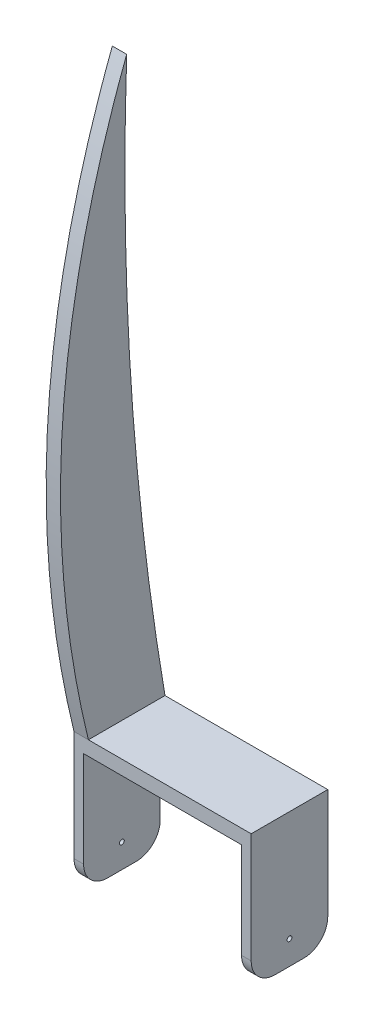
ISO-10303-21;
HEADER;
FILE_DESCRIPTION(('STEP AP214'),'2;1');
FILE_NAME('part.step','',(''),(''),'','','');
FILE_SCHEMA(('AUTOMOTIVE_DESIGN { 1 0 10303 214 1 1 1 1 }'));
ENDSEC;
DATA;
#1=APPLICATION_CONTEXT('core data for automotive mechanical design processes');
#2=APPLICATION_PROTOCOL_DEFINITION('international standard','automotive_design',2000,#1);
#3=PRODUCT_CONTEXT('',#1,'mechanical');
#4=PRODUCT('Part','Part','',(#3));
#5=PRODUCT_RELATED_PRODUCT_CATEGORY('part','',(#4));
#6=PRODUCT_DEFINITION_FORMATION('','',#4);
#7=PRODUCT_DEFINITION_CONTEXT('part definition',#1,'design');
#8=PRODUCT_DEFINITION('design','',#6,#7);
#9=PRODUCT_DEFINITION_SHAPE('','',#8);
#10=(LENGTH_UNIT() NAMED_UNIT(*) SI_UNIT(.MILLI.,.METRE.));
#11=(NAMED_UNIT(*) PLANE_ANGLE_UNIT() SI_UNIT($,.RADIAN.));
#12=(NAMED_UNIT(*) SI_UNIT($,.STERADIAN.) SOLID_ANGLE_UNIT());
#13=UNCERTAINTY_MEASURE_WITH_UNIT(LENGTH_MEASURE(1.E-05),#10,'distance_accuracy_value','');
#14=(GEOMETRIC_REPRESENTATION_CONTEXT(3) GLOBAL_UNCERTAINTY_ASSIGNED_CONTEXT((#13)) GLOBAL_UNIT_ASSIGNED_CONTEXT((#10,
#11,#12)) REPRESENTATION_CONTEXT('',''));
#15=CARTESIAN_POINT('',(0.,0.,0.));
#16=DIRECTION('',(0.,0.,1.));
#17=DIRECTION('',(1.,0.,0.));
#18=AXIS2_PLACEMENT_3D('',#15,#16,#17);
#19=CARTESIAN_POINT('',(0.,3.,0.));
#20=DIRECTION('',(0.,1.,0.));
#21=DIRECTION('',(0.,0.,1.));
#22=AXIS2_PLACEMENT_3D('',#19,#20,#21);
#23=PLANE('',#22);
#24=DIRECTION('',(-1.,0.,0.));
#25=VECTOR('',#24,1.);
#26=CARTESIAN_POINT('',(18.5,3.,-8.));
#27=LINE('',#26,#25);
#28=CARTESIAN_POINT('',(18.5,3.,-8.));
#29=VERTEX_POINT('',#28);
#30=CARTESIAN_POINT('',(-15.5,3.,-7.99999999999999));
#31=VERTEX_POINT('',#30);
#32=EDGE_CURVE('E284',#29,#31,#27,.T.);
#33=ORIENTED_EDGE('',*,*,#32,.T.);
#34=DIRECTION('',(0.,0.,1.));
#35=VECTOR('',#34,1.);
#36=CARTESIAN_POINT('',(-15.5,3.,8.00000000000001));
#37=LINE('',#36,#35);
#38=CARTESIAN_POINT('',(-15.5,3.,8.00000000000001));
#39=VERTEX_POINT('',#38);
#40=EDGE_CURVE('E153',#31,#39,#37,.T.);
#41=ORIENTED_EDGE('',*,*,#40,.T.);
#42=DIRECTION('',(1.,0.,0.));
#43=VECTOR('',#42,1.);
#44=CARTESIAN_POINT('',(18.5,3.,8.));
#45=LINE('',#44,#43);
#46=CARTESIAN_POINT('',(18.5,3.,8.));
#47=VERTEX_POINT('',#46);
#48=EDGE_CURVE('E281',#39,#47,#45,.T.);
#49=ORIENTED_EDGE('',*,*,#48,.T.);
#50=DIRECTION('',(0.,0.,-1.));
#51=VECTOR('',#50,1.);
#52=CARTESIAN_POINT('',(18.5,3.,8.));
#53=LINE('',#52,#51);
#54=EDGE_CURVE('E280',#47,#29,#53,.T.);
#55=ORIENTED_EDGE('',*,*,#54,.T.);
#56=EDGE_LOOP('',(#33,#41,#49,#55));
#57=FACE_BOUND('',#56,.T.);
#58=ADVANCED_FACE('F39',(#57),#23,.T.);
#59=CARTESIAN_POINT('',(0.,0.,0.));
#60=DIRECTION('',(0.,1.,0.));
#61=DIRECTION('',(0.,0.,1.));
#62=AXIS2_PLACEMENT_3D('',#59,#60,#61);
#63=PLANE('',#62);
#64=DIRECTION('',(0.,0.,1.));
#65=VECTOR('',#64,1.);
#66=CARTESIAN_POINT('',(-16.5,0.,-7.99999999999999));
#67=LINE('',#66,#65);
#68=CARTESIAN_POINT('',(-16.5,0.,-7.99999999999999));
#69=VERTEX_POINT('',#68);
#70=CARTESIAN_POINT('',(-16.5,0.,8.00000000000001));
#71=VERTEX_POINT('',#70);
#72=EDGE_CURVE('E363',#69,#71,#67,.T.);
#73=ORIENTED_EDGE('',*,*,#72,.F.);
#74=DIRECTION('',(-1.,0.,0.));
#75=VECTOR('',#74,1.);
#76=CARTESIAN_POINT('',(18.5,0.,-8.));
#77=LINE('',#76,#75);
#78=CARTESIAN_POINT('',(16.5,0.,-8.));
#79=VERTEX_POINT('',#78);
#80=EDGE_CURVE('E292',#79,#69,#77,.T.);
#81=ORIENTED_EDGE('',*,*,#80,.F.);
#82=DIRECTION('',(0.,0.,-1.));
#83=VECTOR('',#82,1.);
#84=CARTESIAN_POINT('',(16.5,0.,-8.));
#85=LINE('',#84,#83);
#86=CARTESIAN_POINT('',(16.5,0.,8.));
#87=VERTEX_POINT('',#86);
#88=EDGE_CURVE('E260',#87,#79,#85,.T.);
#89=ORIENTED_EDGE('',*,*,#88,.F.);
#90=DIRECTION('',(1.,0.,0.));
#91=VECTOR('',#90,1.);
#92=CARTESIAN_POINT('',(18.5,0.,8.));
#93=LINE('',#92,#91);
#94=EDGE_CURVE('E277',#71,#87,#93,.T.);
#95=ORIENTED_EDGE('',*,*,#94,.F.);
#96=EDGE_LOOP('',(#73,#81,#89,#95));
#97=FACE_BOUND('',#96,.T.);
#98=ADVANCED_FACE('F208',(#97),#63,.F.);
#99=CARTESIAN_POINT('',(-18.5,3.,8.00000000000001));
#100=DIRECTION('',(1.,0.,0.));
#101=DIRECTION('',(0.,0.,-1.));
#102=AXIS2_PLACEMENT_3D('',#99,#100,#101);
#103=PLANE('',#102);
#104=CARTESIAN_POINT('',(-18.5,-20.,0.));
#105=DIRECTION('',(1.,0.,0.));
#106=DIRECTION('',(0.,0.,-1.));
#107=AXIS2_PLACEMENT_3D('',#104,#105,#106);
#108=CIRCLE('',#107,0.5);
#109=CARTESIAN_POINT('',(-18.5,-20.,-0.5));
#110=VERTEX_POINT('',#109);
#111=EDGE_CURVE('E406',#110,#110,#108,.T.);
#112=ORIENTED_EDGE('',*,*,#111,.T.);
#113=EDGE_LOOP('',(#112));
#114=FACE_BOUND('',#113,.T.);
#115=DIRECTION('',(0.,0.,-1.));
#116=VECTOR('',#115,1.);
#117=CARTESIAN_POINT('',(-18.5,-25.,-7.99999999999999));
#118=LINE('',#117,#116);
#119=CARTESIAN_POINT('',(-18.5,-25.,3.00000000000001));
#120=VERTEX_POINT('',#119);
#121=CARTESIAN_POINT('',(-18.5,-25.,-2.99999999999999));
#122=VERTEX_POINT('',#121);
#123=EDGE_CURVE('E373',#120,#122,#118,.T.);
#124=ORIENTED_EDGE('',*,*,#123,.F.);
#125=CARTESIAN_POINT('',(-18.5,-20.,3.00000000000001));
#126=DIRECTION('',(1.,0.,0.));
#127=DIRECTION('',(0.,0.,-1.));
#128=AXIS2_PLACEMENT_3D('',#125,#126,#127);
#129=CIRCLE('',#128,5.);
#130=CARTESIAN_POINT('',(-18.5,-20.,8.00000000000001));
#131=VERTEX_POINT('',#130);
#132=EDGE_CURVE('E320',#120,#131,#129,.F.);
#133=ORIENTED_EDGE('',*,*,#132,.T.);
#134=DIRECTION('',(0.,-1.,0.));
#135=VECTOR('',#134,1.);
#136=CARTESIAN_POINT('',(-18.5,3.,8.00000000000001));
#137=LINE('',#136,#135);
#138=CARTESIAN_POINT('',(-18.5,3.,8.00000000000001));
#139=VERTEX_POINT('',#138);
#140=EDGE_CURVE('E305',#139,#131,#137,.T.);
#141=ORIENTED_EDGE('',*,*,#140,.F.);
#142=CARTESIAN_POINT('',(-18.5,3.,8.00000000000001));
#143=CARTESIAN_POINT('',(-18.5,63.3166084997748,22.7942618839066));
#144=CARTESIAN_POINT('',(-18.5,123.,0.));
#145=B_SPLINE_CURVE_WITH_KNOTS('',2,(#142,#143,#144),.UNSPECIFIED.,.F.,.F.,(3,3),(0.,1.),.UNSPECIFIED.);
#146=CARTESIAN_POINT('',(-18.5,123.,0.));
#147=VERTEX_POINT('',#146);
#148=EDGE_CURVE('E166',#139,#147,#145,.T.);
#149=ORIENTED_EDGE('',*,*,#148,.T.);
#150=CARTESIAN_POINT('',(-18.5,123.,0.));
#151=CARTESIAN_POINT('',(-18.5,62.2723062541284,2.13872335734688));
#152=CARTESIAN_POINT('',(-18.5,3.,-7.99999999999999));
#153=B_SPLINE_CURVE_WITH_KNOTS('',2,(#150,#151,#152),.UNSPECIFIED.,.F.,.F.,(3,3),(0.,1.),.UNSPECIFIED.);
#154=CARTESIAN_POINT('',(-18.5,3.,-7.99999999999999));
#155=VERTEX_POINT('',#154);
#156=EDGE_CURVE('E148',#147,#155,#153,.T.);
#157=ORIENTED_EDGE('',*,*,#156,.T.);
#158=DIRECTION('',(0.,-1.,0.));
#159=VECTOR('',#158,1.);
#160=CARTESIAN_POINT('',(-18.5,3.,-7.99999999999999));
#161=LINE('',#160,#159);
#162=CARTESIAN_POINT('',(-18.5,-20.,-7.99999999999999));
#163=VERTEX_POINT('',#162);
#164=EDGE_CURVE('E288',#155,#163,#161,.T.);
#165=ORIENTED_EDGE('',*,*,#164,.T.);
#166=CARTESIAN_POINT('',(-18.5,-20.,-2.99999999999999));
#167=DIRECTION('',(1.,0.,0.));
#168=DIRECTION('',(0.,0.,-1.));
#169=AXIS2_PLACEMENT_3D('',#166,#167,#168);
#170=CIRCLE('',#169,5.);
#171=EDGE_CURVE('E317',#163,#122,#170,.F.);
#172=ORIENTED_EDGE('',*,*,#171,.T.);
#173=EDGE_LOOP('',(#124,#133,#141,#149,#157,#165,#172));
#174=FACE_BOUND('',#173,.T.);
#175=ADVANCED_FACE('F212',(#114,#174),#103,.F.);
#176=CARTESIAN_POINT('',(18.5,3.,8.));
#177=DIRECTION('',(0.,0.,-1.));
#178=DIRECTION('',(-1.,0.,0.));
#179=AXIS2_PLACEMENT_3D('',#176,#177,#178);
#180=PLANE('',#179);
#181=ORIENTED_EDGE('',*,*,#140,.T.);
#182=DIRECTION('',(-1.,0.,0.));
#183=VECTOR('',#182,1.);
#184=CARTESIAN_POINT('',(18.5,-20.,8.));
#185=LINE('',#184,#183);
#186=CARTESIAN_POINT('',(-16.5,-20.,8.00000000000001));
#187=VERTEX_POINT('',#186);
#188=EDGE_CURVE('E325',#131,#187,#185,.F.);
#189=ORIENTED_EDGE('',*,*,#188,.T.);
#190=DIRECTION('',(0.,1.,0.));
#191=VECTOR('',#190,1.);
#192=CARTESIAN_POINT('',(-16.5,-25.,8.00000000000001));
#193=LINE('',#192,#191);
#194=EDGE_CURVE('E367',#187,#71,#193,.T.);
#195=ORIENTED_EDGE('',*,*,#194,.T.);
#196=ORIENTED_EDGE('',*,*,#94,.T.);
#197=DIRECTION('',(0.,1.,0.));
#198=VECTOR('',#197,1.);
#199=CARTESIAN_POINT('',(16.5,-25.,8.00000000000001));
#200=LINE('',#199,#198);
#201=CARTESIAN_POINT('',(16.5,-20.,8.00000000000001));
#202=VERTEX_POINT('',#201);
#203=EDGE_CURVE('E274',#202,#87,#200,.T.);
#204=ORIENTED_EDGE('',*,*,#203,.F.);
#205=DIRECTION('',(-1.,0.,0.));
#206=VECTOR('',#205,1.);
#207=CARTESIAN_POINT('',(18.5,-20.,8.));
#208=LINE('',#207,#206);
#209=CARTESIAN_POINT('',(18.5,-20.,8.));
#210=VERTEX_POINT('',#209);
#211=EDGE_CURVE('E244',#202,#210,#208,.F.);
#212=ORIENTED_EDGE('',*,*,#211,.T.);
#213=DIRECTION('',(0.,-1.,0.));
#214=VECTOR('',#213,1.);
#215=CARTESIAN_POINT('',(18.5,3.,8.));
#216=LINE('',#215,#214);
#217=EDGE_CURVE('E254',#47,#210,#216,.T.);
#218=ORIENTED_EDGE('',*,*,#217,.F.);
#219=ORIENTED_EDGE('',*,*,#48,.F.);
#220=EDGE_CURVE('E162',#139,#39,#45,.T.);
#221=ORIENTED_EDGE('',*,*,#220,.F.);
#222=EDGE_LOOP('',(#181,#189,#195,#196,#204,#212,#218,#219,#221));
#223=FACE_BOUND('',#222,.T.);
#224=ADVANCED_FACE('F220',(#223),#180,.F.);
#225=CARTESIAN_POINT('',(18.5,3.,8.));
#226=DIRECTION('',(-1.,0.,0.));
#227=DIRECTION('',(0.,0.,1.));
#228=AXIS2_PLACEMENT_3D('',#225,#226,#227);
#229=PLANE('',#228);
#230=CARTESIAN_POINT('',(18.5,-20.,0.));
#231=DIRECTION('',(-1.,0.,0.));
#232=DIRECTION('',(0.,0.,1.));
#233=AXIS2_PLACEMENT_3D('',#230,#231,#232);
#234=CIRCLE('',#233,0.5);
#235=CARTESIAN_POINT('',(18.5,-20.,0.5));
#236=VERTEX_POINT('',#235);
#237=EDGE_CURVE('E383',#236,#236,#234,.T.);
#238=ORIENTED_EDGE('',*,*,#237,.T.);
#239=EDGE_LOOP('',(#238));
#240=FACE_BOUND('',#239,.T.);
#241=ORIENTED_EDGE('',*,*,#217,.T.);
#242=CARTESIAN_POINT('',(18.5,-20.,3.));
#243=DIRECTION('',(-1.,0.,0.));
#244=DIRECTION('',(0.,0.,1.));
#245=AXIS2_PLACEMENT_3D('',#242,#243,#244);
#246=CIRCLE('',#245,5.);
#247=CARTESIAN_POINT('',(18.5,-25.,3.));
#248=VERTEX_POINT('',#247);
#249=EDGE_CURVE('E11',#210,#248,#246,.F.);
#250=ORIENTED_EDGE('',*,*,#249,.T.);
#251=DIRECTION('',(0.,0.,1.));
#252=VECTOR('',#251,1.);
#253=CARTESIAN_POINT('',(18.5,-25.,-8.));
#254=LINE('',#253,#252);
#255=CARTESIAN_POINT('',(18.5,-25.,-3.));
#256=VERTEX_POINT('',#255);
#257=EDGE_CURVE('E251',#256,#248,#254,.T.);
#258=ORIENTED_EDGE('',*,*,#257,.F.);
#259=CARTESIAN_POINT('',(18.5,-20.,-3.));
#260=DIRECTION('',(-1.,0.,0.));
#261=DIRECTION('',(0.,0.,1.));
#262=AXIS2_PLACEMENT_3D('',#259,#260,#261);
#263=CIRCLE('',#262,5.);
#264=CARTESIAN_POINT('',(18.5,-20.,-8.));
#265=VERTEX_POINT('',#264);
#266=EDGE_CURVE('E49',#256,#265,#263,.F.);
#267=ORIENTED_EDGE('',*,*,#266,.T.);
#268=DIRECTION('',(0.,-1.,0.));
#269=VECTOR('',#268,1.);
#270=CARTESIAN_POINT('',(18.5,3.,-8.));
#271=LINE('',#270,#269);
#272=EDGE_CURVE('E299',#29,#265,#271,.T.);
#273=ORIENTED_EDGE('',*,*,#272,.F.);
#274=ORIENTED_EDGE('',*,*,#54,.F.);
#275=EDGE_LOOP('',(#241,#250,#258,#267,#273,#274));
#276=FACE_BOUND('',#275,.T.);
#277=ADVANCED_FACE('F216',(#240,#276),#229,.F.);
#278=CARTESIAN_POINT('',(18.5,3.,-8.));
#279=DIRECTION('',(0.,0.,1.));
#280=DIRECTION('',(1.,0.,0.));
#281=AXIS2_PLACEMENT_3D('',#278,#279,#280);
#282=PLANE('',#281);
#283=DIRECTION('',(0.,1.,0.));
#284=VECTOR('',#283,1.);
#285=CARTESIAN_POINT('',(-16.5,-25.,-7.99999999999999));
#286=LINE('',#285,#284);
#287=CARTESIAN_POINT('',(-16.5,-20.,-7.99999999999999));
#288=VERTEX_POINT('',#287);
#289=EDGE_CURVE('E267',#288,#69,#286,.T.);
#290=ORIENTED_EDGE('',*,*,#289,.F.);
#291=DIRECTION('',(1.,0.,0.));
#292=VECTOR('',#291,1.);
#293=CARTESIAN_POINT('',(18.5,-20.,-8.));
#294=LINE('',#293,#292);
#295=EDGE_CURVE('E337',#288,#163,#294,.F.);
#296=ORIENTED_EDGE('',*,*,#295,.T.);
#297=ORIENTED_EDGE('',*,*,#164,.F.);
#298=DIRECTION('',(-1.,0.,0.));
#299=VECTOR('',#298,1.);
#300=CARTESIAN_POINT('',(-15.5,3.,-7.99999999999999));
#301=LINE('',#300,#299);
#302=EDGE_CURVE('E152',#31,#155,#301,.T.);
#303=ORIENTED_EDGE('',*,*,#302,.F.);
#304=ORIENTED_EDGE('',*,*,#32,.F.);
#305=ORIENTED_EDGE('',*,*,#272,.T.);
#306=DIRECTION('',(1.,0.,0.));
#307=VECTOR('',#306,1.);
#308=CARTESIAN_POINT('',(16.5,-20.,-8.));
#309=LINE('',#308,#307);
#310=CARTESIAN_POINT('',(16.5,-20.,-8.));
#311=VERTEX_POINT('',#310);
#312=EDGE_CURVE('E334',#265,#311,#309,.F.);
#313=ORIENTED_EDGE('',*,*,#312,.T.);
#314=DIRECTION('',(0.,1.,0.));
#315=VECTOR('',#314,1.);
#316=CARTESIAN_POINT('',(16.5,-25.,-8.));
#317=LINE('',#316,#315);
#318=EDGE_CURVE('E264',#311,#79,#317,.T.);
#319=ORIENTED_EDGE('',*,*,#318,.T.);
#320=ORIENTED_EDGE('',*,*,#80,.T.);
#321=EDGE_LOOP('',(#290,#296,#297,#303,#304,#305,#313,#319,#320));
#322=FACE_BOUND('',#321,.T.);
#323=ADVANCED_FACE('F204',(#322),#282,.F.);
#324=CARTESIAN_POINT('',(16.5,-25.,-8.));
#325=DIRECTION('',(1.,0.,0.));
#326=DIRECTION('',(0.,0.,-1.));
#327=AXIS2_PLACEMENT_3D('',#324,#325,#326);
#328=PLANE('',#327);
#329=CARTESIAN_POINT('',(16.5,-20.,0.));
#330=DIRECTION('',(1.,0.,0.));
#331=DIRECTION('',(0.,0.,-1.));
#332=AXIS2_PLACEMENT_3D('',#329,#330,#331);
#333=CIRCLE('',#332,0.5);
#334=CARTESIAN_POINT('',(16.5,-20.,-0.5));
#335=VERTEX_POINT('',#334);
#336=EDGE_CURVE('E410',#335,#335,#333,.T.);
#337=ORIENTED_EDGE('',*,*,#336,.T.);
#338=EDGE_LOOP('',(#337));
#339=FACE_BOUND('',#338,.T.);
#340=DIRECTION('',(0.,0.,-1.));
#341=VECTOR('',#340,1.);
#342=CARTESIAN_POINT('',(16.5,-25.,-8.));
#343=LINE('',#342,#341);
#344=CARTESIAN_POINT('',(16.5,-25.,3.));
#345=VERTEX_POINT('',#344);
#346=CARTESIAN_POINT('',(16.5,-25.,-3.));
#347=VERTEX_POINT('',#346);
#348=EDGE_CURVE('E259',#345,#347,#343,.T.);
#349=ORIENTED_EDGE('',*,*,#348,.F.);
#350=CARTESIAN_POINT('',(16.5,-20.,3.));
#351=DIRECTION('',(1.,0.,0.));
#352=DIRECTION('',(0.,0.,-1.));
#353=AXIS2_PLACEMENT_3D('',#350,#351,#352);
#354=CIRCLE('',#353,5.);
#355=EDGE_CURVE('E346',#345,#202,#354,.F.);
#356=ORIENTED_EDGE('',*,*,#355,.T.);
#357=ORIENTED_EDGE('',*,*,#203,.T.);
#358=ORIENTED_EDGE('',*,*,#88,.T.);
#359=ORIENTED_EDGE('',*,*,#318,.F.);
#360=CARTESIAN_POINT('',(16.5,-20.,-3.));
#361=DIRECTION('',(1.,0.,0.));
#362=DIRECTION('',(0.,0.,-1.));
#363=AXIS2_PLACEMENT_3D('',#360,#361,#362);
#364=CIRCLE('',#363,5.);
#365=EDGE_CURVE('E64',#311,#347,#364,.F.);
#366=ORIENTED_EDGE('',*,*,#365,.T.);
#367=EDGE_LOOP('',(#349,#356,#357,#358,#359,#366));
#368=FACE_BOUND('',#367,.T.);
#369=ADVANCED_FACE('F200',(#339,#368),#328,.F.);
#370=CARTESIAN_POINT('',(0.,-25.,0.));
#371=DIRECTION('',(0.,-1.,0.));
#372=DIRECTION('',(0.,0.,-1.));
#373=AXIS2_PLACEMENT_3D('',#370,#371,#372);
#374=PLANE('',#373);
#375=ORIENTED_EDGE('',*,*,#257,.T.);
#376=DIRECTION('',(-1.,0.,0.));
#377=VECTOR('',#376,1.);
#378=CARTESIAN_POINT('',(16.5,-25.,3.));
#379=LINE('',#378,#377);
#380=EDGE_CURVE('E246',#248,#345,#379,.T.);
#381=ORIENTED_EDGE('',*,*,#380,.T.);
#382=ORIENTED_EDGE('',*,*,#348,.T.);
#383=DIRECTION('',(1.,0.,0.));
#384=VECTOR('',#383,1.);
#385=CARTESIAN_POINT('',(18.5,-25.,-3.));
#386=LINE('',#385,#384);
#387=EDGE_CURVE('E257',#347,#256,#386,.T.);
#388=ORIENTED_EDGE('',*,*,#387,.T.);
#389=EDGE_LOOP('',(#375,#381,#382,#388));
#390=FACE_BOUND('',#389,.T.);
#391=ADVANCED_FACE('F196',(#390),#374,.T.);
#392=CARTESIAN_POINT('',(-16.5,-25.,-7.99999999999999));
#393=DIRECTION('',(-1.,0.,0.));
#394=DIRECTION('',(0.,0.,1.));
#395=AXIS2_PLACEMENT_3D('',#392,#393,#394);
#396=PLANE('',#395);
#397=CARTESIAN_POINT('',(-16.5,-20.,0.));
#398=DIRECTION('',(-1.,0.,0.));
#399=DIRECTION('',(0.,0.,1.));
#400=AXIS2_PLACEMENT_3D('',#397,#398,#399);
#401=CIRCLE('',#400,0.5);
#402=CARTESIAN_POINT('',(-16.5,-20.,0.5));
#403=VERTEX_POINT('',#402);
#404=EDGE_CURVE('E43',#403,#403,#401,.T.);
#405=ORIENTED_EDGE('',*,*,#404,.T.);
#406=EDGE_LOOP('',(#405));
#407=FACE_BOUND('',#406,.T.);
#408=ORIENTED_EDGE('',*,*,#194,.F.);
#409=CARTESIAN_POINT('',(-16.5,-20.,3.00000000000001));
#410=DIRECTION('',(-1.,0.,0.));
#411=DIRECTION('',(0.,0.,1.));
#412=AXIS2_PLACEMENT_3D('',#409,#410,#411);
#413=CIRCLE('',#412,5.);
#414=CARTESIAN_POINT('',(-16.5,-25.,3.00000000000001));
#415=VERTEX_POINT('',#414);
#416=EDGE_CURVE('E331',#187,#415,#413,.F.);
#417=ORIENTED_EDGE('',*,*,#416,.T.);
#418=DIRECTION('',(0.,0.,1.));
#419=VECTOR('',#418,1.);
#420=CARTESIAN_POINT('',(-16.5,-25.,-7.99999999999999));
#421=LINE('',#420,#419);
#422=CARTESIAN_POINT('',(-16.5,-25.,-2.99999999999999));
#423=VERTEX_POINT('',#422);
#424=EDGE_CURVE('E378',#423,#415,#421,.T.);
#425=ORIENTED_EDGE('',*,*,#424,.F.);
#426=CARTESIAN_POINT('',(-16.5,-20.,-2.99999999999999));
#427=DIRECTION('',(-1.,0.,0.));
#428=DIRECTION('',(0.,0.,1.));
#429=AXIS2_PLACEMENT_3D('',#426,#427,#428);
#430=CIRCLE('',#429,5.);
#431=EDGE_CURVE('E328',#423,#288,#430,.F.);
#432=ORIENTED_EDGE('',*,*,#431,.T.);
#433=ORIENTED_EDGE('',*,*,#289,.T.);
#434=ORIENTED_EDGE('',*,*,#72,.T.);
#435=EDGE_LOOP('',(#408,#417,#425,#432,#433,#434));
#436=FACE_BOUND('',#435,.T.);
#437=ADVANCED_FACE('F192',(#407,#436),#396,.F.);
#438=CARTESIAN_POINT('',(0.,-25.,0.));
#439=DIRECTION('',(0.,1.,0.));
#440=DIRECTION('',(0.,0.,1.));
#441=AXIS2_PLACEMENT_3D('',#438,#439,#440);
#442=PLANE('',#441);
#443=ORIENTED_EDGE('',*,*,#424,.T.);
#444=DIRECTION('',(-1.,0.,0.));
#445=VECTOR('',#444,1.);
#446=CARTESIAN_POINT('',(0.,-25.,3.));
#447=LINE('',#446,#445);
#448=EDGE_CURVE('E313',#415,#120,#447,.T.);
#449=ORIENTED_EDGE('',*,*,#448,.T.);
#450=ORIENTED_EDGE('',*,*,#123,.T.);
#451=DIRECTION('',(1.,0.,0.));
#452=VECTOR('',#451,1.);
#453=CARTESIAN_POINT('',(0.,-25.,-2.99999999999999));
#454=LINE('',#453,#452);
#455=EDGE_CURVE('E309',#122,#423,#454,.T.);
#456=ORIENTED_EDGE('',*,*,#455,.T.);
#457=EDGE_LOOP('',(#443,#449,#450,#456));
#458=FACE_BOUND('',#457,.T.);
#459=ADVANCED_FACE('F188',(#458),#442,.F.);
#460=CARTESIAN_POINT('',(0.,-20.,3.));
#461=DIRECTION('',(-1.,0.,0.));
#462=DIRECTION('',(0.,0.,1.));
#463=AXIS2_PLACEMENT_3D('',#460,#461,#462);
#464=CYLINDRICAL_SURFACE('',#463,5.);
#465=ORIENTED_EDGE('',*,*,#416,.F.);
#466=ORIENTED_EDGE('',*,*,#188,.F.);
#467=ORIENTED_EDGE('',*,*,#132,.F.);
#468=ORIENTED_EDGE('',*,*,#448,.F.);
#469=EDGE_LOOP('',(#465,#466,#467,#468));
#470=FACE_BOUND('',#469,.T.);
#471=ADVANCED_FACE('F191',(#470),#464,.T.);
#472=CARTESIAN_POINT('',(0.,-20.,-2.99999999999999));
#473=DIRECTION('',(1.,0.,0.));
#474=DIRECTION('',(0.,0.,-1.));
#475=AXIS2_PLACEMENT_3D('',#472,#473,#474);
#476=CYLINDRICAL_SURFACE('',#475,5.);
#477=ORIENTED_EDGE('',*,*,#171,.F.);
#478=ORIENTED_EDGE('',*,*,#295,.F.);
#479=ORIENTED_EDGE('',*,*,#431,.F.);
#480=ORIENTED_EDGE('',*,*,#455,.F.);
#481=EDGE_LOOP('',(#477,#478,#479,#480));
#482=FACE_BOUND('',#481,.T.);
#483=ADVANCED_FACE('F230',(#482),#476,.T.);
#484=CARTESIAN_POINT('',(0.,-20.,3.));
#485=DIRECTION('',(1.,0.,0.));
#486=DIRECTION('',(0.,0.,-1.));
#487=AXIS2_PLACEMENT_3D('',#484,#485,#486);
#488=CYLINDRICAL_SURFACE('',#487,5.);
#489=ORIENTED_EDGE('',*,*,#249,.F.);
#490=ORIENTED_EDGE('',*,*,#211,.F.);
#491=ORIENTED_EDGE('',*,*,#355,.F.);
#492=ORIENTED_EDGE('',*,*,#380,.F.);
#493=EDGE_LOOP('',(#489,#490,#491,#492));
#494=FACE_BOUND('',#493,.T.);
#495=ADVANCED_FACE('F233',(#494),#488,.T.);
#496=CARTESIAN_POINT('',(0.,-20.,-2.99999999999999));
#497=DIRECTION('',(-1.,0.,0.));
#498=DIRECTION('',(0.,0.,1.));
#499=AXIS2_PLACEMENT_3D('',#496,#497,#498);
#500=CYLINDRICAL_SURFACE('',#499,5.);
#501=ORIENTED_EDGE('',*,*,#365,.F.);
#502=ORIENTED_EDGE('',*,*,#312,.F.);
#503=ORIENTED_EDGE('',*,*,#266,.F.);
#504=ORIENTED_EDGE('',*,*,#387,.F.);
#505=EDGE_LOOP('',(#501,#502,#503,#504));
#506=FACE_BOUND('',#505,.T.);
#507=ADVANCED_FACE('F41',(#506),#500,.T.);
#508=CARTESIAN_POINT('',(-18.5,-20.,0.));
#509=DIRECTION('',(1.,0.,0.));
#510=DIRECTION('',(0.,0.,-1.));
#511=AXIS2_PLACEMENT_3D('',#508,#509,#510);
#512=CYLINDRICAL_SURFACE('',#511,0.5);
#513=ORIENTED_EDGE('',*,*,#111,.F.);
#514=EDGE_LOOP('',(#513));
#515=FACE_BOUND('',#514,.T.);
#516=ORIENTED_EDGE('',*,*,#404,.F.);
#517=EDGE_LOOP('',(#516));
#518=FACE_BOUND('',#517,.T.);
#519=ADVANCED_FACE('F186',(#515,#518),#512,.F.);
#520=ORIENTED_EDGE('',*,*,#336,.F.);
#521=EDGE_LOOP('',(#520));
#522=FACE_BOUND('',#521,.T.);
#523=ORIENTED_EDGE('',*,*,#237,.F.);
#524=EDGE_LOOP('',(#523));
#525=FACE_BOUND('',#524,.T.);
#526=ADVANCED_FACE('F182',(#522,#525),#512,.F.);
#527=CARTESIAN_POINT('',(-15.5,3.,8.00000000000001));
#528=CARTESIAN_POINT('',(-15.5,63.3166084997748,22.7942618839066));
#529=CARTESIAN_POINT('',(-15.5,123.,0.));
#530=B_SPLINE_CURVE_WITH_KNOTS('',2,(#527,#528,#529),.UNSPECIFIED.,.F.,.F.,(3,3),(0.,1.),.UNSPECIFIED.);
#531=DIRECTION('',(-1.,0.,0.));
#532=VECTOR('',#531,1.);
#533=SURFACE_OF_LINEAR_EXTRUSION('',#530,#532);
#534=ORIENTED_EDGE('',*,*,#148,.F.);
#535=ORIENTED_EDGE('',*,*,#220,.T.);
#536=CARTESIAN_POINT('',(-15.5,123.,0.));
#537=VERTEX_POINT('',#536);
#538=EDGE_CURVE('E56',#39,#537,#530,.T.);
#539=ORIENTED_EDGE('',*,*,#538,.T.);
#540=DIRECTION('',(-1.,0.,0.));
#541=VECTOR('',#540,1.);
#542=CARTESIAN_POINT('',(-15.5,123.,0.));
#543=LINE('',#542,#541);
#544=EDGE_CURVE('E144',#537,#147,#543,.T.);
#545=ORIENTED_EDGE('',*,*,#544,.T.);
#546=EDGE_LOOP('',(#534,#535,#539,#545));
#547=FACE_BOUND('',#546,.T.);
#548=ADVANCED_FACE('F160',(#547),#533,.T.);
#549=CARTESIAN_POINT('',(-15.5,123.,0.));
#550=CARTESIAN_POINT('',(-15.5,62.2723062541284,2.13872335734688));
#551=CARTESIAN_POINT('',(-15.5,3.,-7.99999999999999));
#552=B_SPLINE_CURVE_WITH_KNOTS('',2,(#549,#550,#551),.UNSPECIFIED.,.F.,.F.,(3,3),(0.,1.),.UNSPECIFIED.);
#553=DIRECTION('',(-1.,0.,0.));
#554=VECTOR('',#553,1.);
#555=SURFACE_OF_LINEAR_EXTRUSION('',#552,#554);
#556=ORIENTED_EDGE('',*,*,#156,.F.);
#557=ORIENTED_EDGE('',*,*,#544,.F.);
#558=EDGE_CURVE('E146',#537,#31,#552,.T.);
#559=ORIENTED_EDGE('',*,*,#558,.T.);
#560=ORIENTED_EDGE('',*,*,#302,.T.);
#561=EDGE_LOOP('',(#556,#557,#559,#560));
#562=FACE_BOUND('',#561,.T.);
#563=ADVANCED_FACE('F145',(#562),#555,.T.);
#564=CARTESIAN_POINT('',(-15.5,63.1583042498874,13.3971309419533));
#565=DIRECTION('',(1.,0.,0.));
#566=DIRECTION('',(0.,0.,-1.));
#567=AXIS2_PLACEMENT_3D('',#564,#565,#566);
#568=PLANE('',#567);
#569=ORIENTED_EDGE('',*,*,#538,.F.);
#570=ORIENTED_EDGE('',*,*,#40,.F.);
#571=ORIENTED_EDGE('',*,*,#558,.F.);
#572=EDGE_LOOP('',(#569,#570,#571));
#573=FACE_BOUND('',#572,.T.);
#574=ADVANCED_FACE('F155',(#573),#568,.T.);
#575=CLOSED_SHELL('',(#58,#98,#175,#224,#277,#323,#369,#391,#437,#459,#471,#483,#495,#507,#519,
#526,#548,#563,#574));
#576=MANIFOLD_SOLID_BREP('B2',#575);
#577=ADVANCED_BREP_SHAPE_REPRESENTATION('',(#18,#576),#14);
#578=SHAPE_DEFINITION_REPRESENTATION(#9,#577);
ENDSEC;
END-ISO-10303-21;
